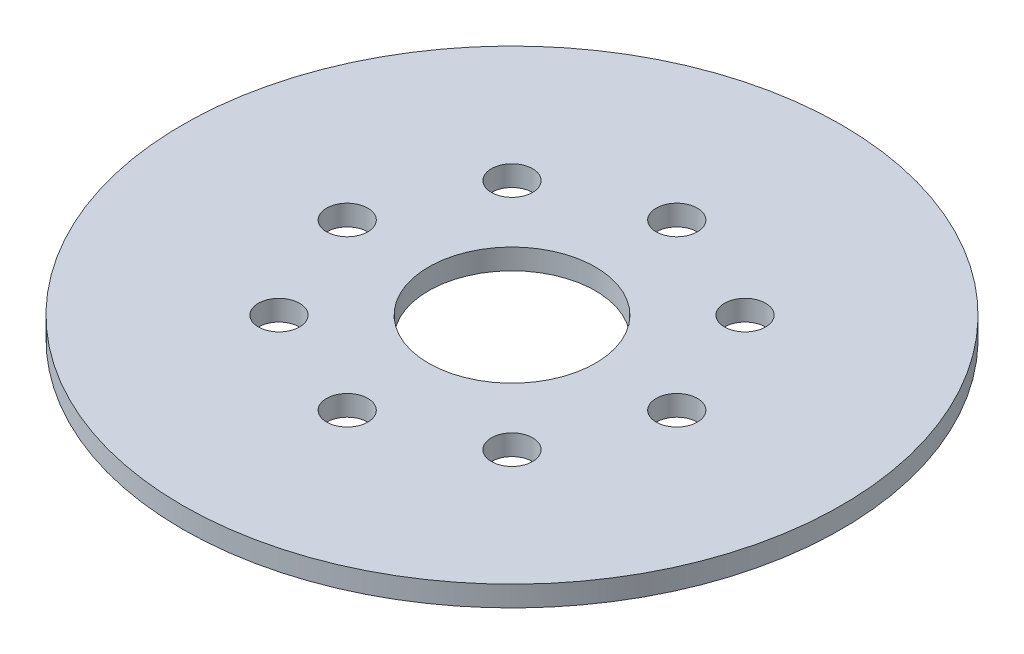
ISO-10303-21;
HEADER;
FILE_DESCRIPTION(('STEP AP214'),'2;1');
FILE_NAME('part.step','',(''),(''),'','','');
FILE_SCHEMA(('AUTOMOTIVE_DESIGN { 1 0 10303 214 1 1 1 1 }'));
ENDSEC;
DATA;
#1=APPLICATION_CONTEXT('core data for automotive mechanical design processes');
#2=APPLICATION_PROTOCOL_DEFINITION('international standard','automotive_design',2000,#1);
#3=PRODUCT_CONTEXT('',#1,'mechanical');
#4=PRODUCT('Part','Part','',(#3));
#5=PRODUCT_RELATED_PRODUCT_CATEGORY('part','',(#4));
#6=PRODUCT_DEFINITION_FORMATION('','',#4);
#7=PRODUCT_DEFINITION_CONTEXT('part definition',#1,'design');
#8=PRODUCT_DEFINITION('design','',#6,#7);
#9=PRODUCT_DEFINITION_SHAPE('','',#8);
#10=(LENGTH_UNIT() NAMED_UNIT(*) SI_UNIT(.MILLI.,.METRE.));
#11=(NAMED_UNIT(*) PLANE_ANGLE_UNIT() SI_UNIT($,.RADIAN.));
#12=(NAMED_UNIT(*) SI_UNIT($,.STERADIAN.) SOLID_ANGLE_UNIT());
#13=UNCERTAINTY_MEASURE_WITH_UNIT(LENGTH_MEASURE(1.E-05),#10,'distance_accuracy_value','');
#14=(GEOMETRIC_REPRESENTATION_CONTEXT(3) GLOBAL_UNCERTAINTY_ASSIGNED_CONTEXT((#13)) GLOBAL_UNIT_ASSIGNED_CONTEXT((#10,
#11,#12)) REPRESENTATION_CONTEXT('',''));
#15=CARTESIAN_POINT('',(0.,0.,0.));
#16=DIRECTION('',(0.,0.,1.));
#17=DIRECTION('',(1.,0.,0.));
#18=AXIS2_PLACEMENT_3D('',#15,#16,#17);
#19=CARTESIAN_POINT('',(0.,1.,0.));
#20=DIRECTION('',(0.,1.,0.));
#21=DIRECTION('',(0.,0.,1.));
#22=AXIS2_PLACEMENT_3D('',#19,#20,#21);
#23=PLANE('',#22);
#24=CARTESIAN_POINT('',(-8.,1.,0.));
#25=DIRECTION('',(0.,1.,0.));
#26=DIRECTION('',(0.,0.,1.));
#27=AXIS2_PLACEMENT_3D('',#24,#25,#26);
#28=CIRCLE('',#27,1.);
#29=CARTESIAN_POINT('',(-8.,1.,0.999999999999917));
#30=VERTEX_POINT('',#29);
#31=EDGE_CURVE('E82',#30,#30,#28,.T.);
#32=ORIENTED_EDGE('',*,*,#31,.F.);
#33=EDGE_LOOP('',(#32));
#34=FACE_BOUND('',#33,.T.);
#35=CARTESIAN_POINT('',(0.,1.,8.));
#36=DIRECTION('',(0.,1.,0.));
#37=DIRECTION('',(0.,0.,1.));
#38=AXIS2_PLACEMENT_3D('',#35,#36,#37);
#39=CIRCLE('',#38,1.);
#40=CARTESIAN_POINT('',(0.,1.,9.));
#41=VERTEX_POINT('',#40);
#42=EDGE_CURVE('E70',#41,#41,#39,.T.);
#43=ORIENTED_EDGE('',*,*,#42,.F.);
#44=EDGE_LOOP('',(#43));
#45=FACE_BOUND('',#44,.T.);
#46=CARTESIAN_POINT('',(8.,1.,0.));
#47=DIRECTION('',(0.,1.,0.));
#48=DIRECTION('',(0.,0.,1.));
#49=AXIS2_PLACEMENT_3D('',#46,#47,#48);
#50=CIRCLE('',#49,1.);
#51=CARTESIAN_POINT('',(8.,1.,1.00000000000003));
#52=VERTEX_POINT('',#51);
#53=EDGE_CURVE('E58',#52,#52,#50,.T.);
#54=ORIENTED_EDGE('',*,*,#53,.F.);
#55=EDGE_LOOP('',(#54));
#56=FACE_BOUND('',#55,.T.);
#57=CARTESIAN_POINT('',(0.,1.,-8.));
#58=DIRECTION('',(0.,1.,0.));
#59=DIRECTION('',(0.,0.,1.));
#60=AXIS2_PLACEMENT_3D('',#57,#58,#59);
#61=CIRCLE('',#60,1.);
#62=CARTESIAN_POINT('',(0.,1.,-7.));
#63=VERTEX_POINT('',#62);
#64=EDGE_CURVE('E46',#63,#63,#61,.T.);
#65=ORIENTED_EDGE('',*,*,#64,.F.);
#66=EDGE_LOOP('',(#65));
#67=FACE_BOUND('',#66,.T.);
#68=CARTESIAN_POINT('',(0.,1.,0.));
#69=DIRECTION('',(0.,1.,0.));
#70=DIRECTION('',(0.,0.,1.));
#71=AXIS2_PLACEMENT_3D('',#68,#69,#70);
#72=CIRCLE('',#71,16.);
#73=CARTESIAN_POINT('',(0.,1.,16.));
#74=VERTEX_POINT('',#73);
#75=EDGE_CURVE('E10',#74,#74,#72,.T.);
#76=ORIENTED_EDGE('',*,*,#75,.T.);
#77=EDGE_LOOP('',(#76));
#78=FACE_BOUND('',#77,.T.);
#79=CARTESIAN_POINT('',(0.,1.,0.));
#80=DIRECTION('',(0.,1.,0.));
#81=DIRECTION('',(0.,0.,1.));
#82=AXIS2_PLACEMENT_3D('',#79,#80,#81);
#83=CIRCLE('',#82,4.05);
#84=CARTESIAN_POINT('',(0.,1.,4.05));
#85=VERTEX_POINT('',#84);
#86=EDGE_CURVE('E41',#85,#85,#83,.T.);
#87=ORIENTED_EDGE('',*,*,#86,.F.);
#88=EDGE_LOOP('',(#87));
#89=FACE_BOUND('',#88,.T.);
#90=CARTESIAN_POINT('',(5.65685424949239,1.,-5.65685424949237));
#91=DIRECTION('',(0.,1.,0.));
#92=DIRECTION('',(0.,0.,1.));
#93=AXIS2_PLACEMENT_3D('',#90,#91,#92);
#94=CIRCLE('',#93,1.);
#95=CARTESIAN_POINT('',(5.65685424949239,1.,-4.65685424949237));
#96=VERTEX_POINT('',#95);
#97=EDGE_CURVE('E52',#96,#96,#94,.T.);
#98=ORIENTED_EDGE('',*,*,#97,.F.);
#99=EDGE_LOOP('',(#98));
#100=FACE_BOUND('',#99,.T.);
#101=CARTESIAN_POINT('',(5.65685424949235,1.,5.65685424949241));
#102=DIRECTION('',(0.,1.,0.));
#103=DIRECTION('',(0.,0.,1.));
#104=AXIS2_PLACEMENT_3D('',#101,#102,#103);
#105=CIRCLE('',#104,1.);
#106=CARTESIAN_POINT('',(5.65685424949235,1.,6.65685424949241));
#107=VERTEX_POINT('',#106);
#108=EDGE_CURVE('E64',#107,#107,#105,.T.);
#109=ORIENTED_EDGE('',*,*,#108,.F.);
#110=EDGE_LOOP('',(#109));
#111=FACE_BOUND('',#110,.T.);
#112=CARTESIAN_POINT('',(-5.65685424949243,1.,5.65685424949233));
#113=DIRECTION('',(0.,1.,0.));
#114=DIRECTION('',(0.,0.,1.));
#115=AXIS2_PLACEMENT_3D('',#112,#113,#114);
#116=CIRCLE('',#115,1.);
#117=CARTESIAN_POINT('',(-5.65685424949243,1.,6.65685424949233));
#118=VERTEX_POINT('',#117);
#119=EDGE_CURVE('E76',#118,#118,#116,.T.);
#120=ORIENTED_EDGE('',*,*,#119,.F.);
#121=EDGE_LOOP('',(#120));
#122=FACE_BOUND('',#121,.T.);
#123=CARTESIAN_POINT('',(-5.65685424949231,1.,-5.65685424949245));
#124=DIRECTION('',(0.,1.,0.));
#125=DIRECTION('',(0.,0.,1.));
#126=AXIS2_PLACEMENT_3D('',#123,#124,#125);
#127=CIRCLE('',#126,1.);
#128=CARTESIAN_POINT('',(-5.65685424949231,1.,-4.65685424949245));
#129=VERTEX_POINT('',#128);
#130=EDGE_CURVE('E88',#129,#129,#127,.T.);
#131=ORIENTED_EDGE('',*,*,#130,.F.);
#132=EDGE_LOOP('',(#131));
#133=FACE_BOUND('',#132,.T.);
#134=ADVANCED_FACE('F30',(#34,#45,#56,#67,#78,#89,#100,#111,#122,#133),#23,.T.);
#135=CARTESIAN_POINT('',(0.,0.,0.));
#136=DIRECTION('',(0.,1.,0.));
#137=DIRECTION('',(0.,0.,1.));
#138=AXIS2_PLACEMENT_3D('',#135,#136,#137);
#139=PLANE('',#138);
#140=CARTESIAN_POINT('',(-8.,0.,0.));
#141=DIRECTION('',(0.,1.,0.));
#142=DIRECTION('',(0.,0.,1.));
#143=AXIS2_PLACEMENT_3D('',#140,#141,#142);
#144=CIRCLE('',#143,1.);
#145=CARTESIAN_POINT('',(-8.,0.,0.999999999999917));
#146=VERTEX_POINT('',#145);
#147=EDGE_CURVE('E85',#146,#146,#144,.T.);
#148=ORIENTED_EDGE('',*,*,#147,.T.);
#149=EDGE_LOOP('',(#148));
#150=FACE_BOUND('',#149,.T.);
#151=CARTESIAN_POINT('',(0.,0.,8.));
#152=DIRECTION('',(0.,1.,0.));
#153=DIRECTION('',(0.,0.,1.));
#154=AXIS2_PLACEMENT_3D('',#151,#152,#153);
#155=CIRCLE('',#154,1.);
#156=CARTESIAN_POINT('',(0.,0.,9.));
#157=VERTEX_POINT('',#156);
#158=EDGE_CURVE('E73',#157,#157,#155,.T.);
#159=ORIENTED_EDGE('',*,*,#158,.T.);
#160=EDGE_LOOP('',(#159));
#161=FACE_BOUND('',#160,.T.);
#162=CARTESIAN_POINT('',(8.,0.,0.));
#163=DIRECTION('',(0.,1.,0.));
#164=DIRECTION('',(0.,0.,1.));
#165=AXIS2_PLACEMENT_3D('',#162,#163,#164);
#166=CIRCLE('',#165,1.);
#167=CARTESIAN_POINT('',(8.,0.,1.00000000000003));
#168=VERTEX_POINT('',#167);
#169=EDGE_CURVE('E61',#168,#168,#166,.T.);
#170=ORIENTED_EDGE('',*,*,#169,.T.);
#171=EDGE_LOOP('',(#170));
#172=FACE_BOUND('',#171,.T.);
#173=CARTESIAN_POINT('',(0.,0.,-8.));
#174=DIRECTION('',(0.,1.,0.));
#175=DIRECTION('',(0.,0.,1.));
#176=AXIS2_PLACEMENT_3D('',#173,#174,#175);
#177=CIRCLE('',#176,1.);
#178=CARTESIAN_POINT('',(0.,0.,-7.));
#179=VERTEX_POINT('',#178);
#180=EDGE_CURVE('E49',#179,#179,#177,.T.);
#181=ORIENTED_EDGE('',*,*,#180,.T.);
#182=EDGE_LOOP('',(#181));
#183=FACE_BOUND('',#182,.T.);
#184=CARTESIAN_POINT('',(0.,0.,0.));
#185=DIRECTION('',(0.,1.,0.));
#186=DIRECTION('',(0.,0.,1.));
#187=AXIS2_PLACEMENT_3D('',#184,#185,#186);
#188=CIRCLE('',#187,16.);
#189=CARTESIAN_POINT('',(0.,0.,16.));
#190=VERTEX_POINT('',#189);
#191=EDGE_CURVE('E34',#190,#190,#188,.T.);
#192=ORIENTED_EDGE('',*,*,#191,.F.);
#193=EDGE_LOOP('',(#192));
#194=FACE_BOUND('',#193,.T.);
#195=CARTESIAN_POINT('',(0.,0.,0.));
#196=DIRECTION('',(0.,1.,0.));
#197=DIRECTION('',(0.,0.,1.));
#198=AXIS2_PLACEMENT_3D('',#195,#196,#197);
#199=CIRCLE('',#198,4.05);
#200=CARTESIAN_POINT('',(0.,0.,4.05));
#201=VERTEX_POINT('',#200);
#202=EDGE_CURVE('E43',#201,#201,#199,.T.);
#203=ORIENTED_EDGE('',*,*,#202,.T.);
#204=EDGE_LOOP('',(#203));
#205=FACE_BOUND('',#204,.T.);
#206=CARTESIAN_POINT('',(5.65685424949239,0.,-5.65685424949237));
#207=DIRECTION('',(0.,1.,0.));
#208=DIRECTION('',(0.,0.,1.));
#209=AXIS2_PLACEMENT_3D('',#206,#207,#208);
#210=CIRCLE('',#209,1.);
#211=CARTESIAN_POINT('',(5.65685424949239,0.,-4.65685424949237));
#212=VERTEX_POINT('',#211);
#213=EDGE_CURVE('E55',#212,#212,#210,.T.);
#214=ORIENTED_EDGE('',*,*,#213,.T.);
#215=EDGE_LOOP('',(#214));
#216=FACE_BOUND('',#215,.T.);
#217=CARTESIAN_POINT('',(5.65685424949235,0.,5.65685424949241));
#218=DIRECTION('',(0.,1.,0.));
#219=DIRECTION('',(0.,0.,1.));
#220=AXIS2_PLACEMENT_3D('',#217,#218,#219);
#221=CIRCLE('',#220,1.);
#222=CARTESIAN_POINT('',(5.65685424949235,0.,6.65685424949241));
#223=VERTEX_POINT('',#222);
#224=EDGE_CURVE('E67',#223,#223,#221,.T.);
#225=ORIENTED_EDGE('',*,*,#224,.T.);
#226=EDGE_LOOP('',(#225));
#227=FACE_BOUND('',#226,.T.);
#228=CARTESIAN_POINT('',(-5.65685424949243,0.,5.65685424949233));
#229=DIRECTION('',(0.,1.,0.));
#230=DIRECTION('',(0.,0.,1.));
#231=AXIS2_PLACEMENT_3D('',#228,#229,#230);
#232=CIRCLE('',#231,1.);
#233=CARTESIAN_POINT('',(-5.65685424949243,0.,6.65685424949233));
#234=VERTEX_POINT('',#233);
#235=EDGE_CURVE('E79',#234,#234,#232,.T.);
#236=ORIENTED_EDGE('',*,*,#235,.T.);
#237=EDGE_LOOP('',(#236));
#238=FACE_BOUND('',#237,.T.);
#239=CARTESIAN_POINT('',(-5.65685424949231,0.,-5.65685424949245));
#240=DIRECTION('',(0.,1.,0.));
#241=DIRECTION('',(0.,0.,1.));
#242=AXIS2_PLACEMENT_3D('',#239,#240,#241);
#243=CIRCLE('',#242,1.);
#244=CARTESIAN_POINT('',(-5.65685424949231,0.,-4.65685424949245));
#245=VERTEX_POINT('',#244);
#246=EDGE_CURVE('E91',#245,#245,#243,.T.);
#247=ORIENTED_EDGE('',*,*,#246,.T.);
#248=EDGE_LOOP('',(#247));
#249=FACE_BOUND('',#248,.T.);
#250=ADVANCED_FACE('F101',(#150,#161,#172,#183,#194,#205,#216,#227,#238,#249),#139,.F.);
#251=CARTESIAN_POINT('',(0.,1.,0.));
#252=DIRECTION('',(0.,-1.,0.));
#253=DIRECTION('',(0.,0.,-1.));
#254=AXIS2_PLACEMENT_3D('',#251,#252,#253);
#255=CYLINDRICAL_SURFACE('',#254,16.);
#256=ORIENTED_EDGE('',*,*,#75,.F.);
#257=EDGE_LOOP('',(#256));
#258=FACE_BOUND('',#257,.T.);
#259=ORIENTED_EDGE('',*,*,#191,.T.);
#260=EDGE_LOOP('',(#259));
#261=FACE_BOUND('',#260,.T.);
#262=ADVANCED_FACE('F32',(#258,#261),#255,.T.);
#263=CARTESIAN_POINT('',(0.,1.,0.));
#264=DIRECTION('',(0.,-1.,0.));
#265=DIRECTION('',(0.,0.,-1.));
#266=AXIS2_PLACEMENT_3D('',#263,#264,#265);
#267=CYLINDRICAL_SURFACE('',#266,4.05);
#268=ORIENTED_EDGE('',*,*,#86,.T.);
#269=EDGE_LOOP('',(#268));
#270=FACE_BOUND('',#269,.T.);
#271=ORIENTED_EDGE('',*,*,#202,.F.);
#272=EDGE_LOOP('',(#271));
#273=FACE_BOUND('',#272,.T.);
#274=ADVANCED_FACE('F111',(#270,#273),#267,.F.);
#275=CARTESIAN_POINT('',(0.,1.,-8.));
#276=DIRECTION('',(0.,-1.,0.));
#277=DIRECTION('',(0.,0.,-1.));
#278=AXIS2_PLACEMENT_3D('',#275,#276,#277);
#279=CYLINDRICAL_SURFACE('',#278,1.);
#280=ORIENTED_EDGE('',*,*,#64,.T.);
#281=EDGE_LOOP('',(#280));
#282=FACE_BOUND('',#281,.T.);
#283=ORIENTED_EDGE('',*,*,#180,.F.);
#284=EDGE_LOOP('',(#283));
#285=FACE_BOUND('',#284,.T.);
#286=ADVANCED_FACE('F114',(#282,#285),#279,.F.);
#287=CARTESIAN_POINT('',(5.65685424949239,1.,-5.65685424949237));
#288=DIRECTION('',(0.,-1.,0.));
#289=DIRECTION('',(0.,0.,-1.));
#290=AXIS2_PLACEMENT_3D('',#287,#288,#289);
#291=CYLINDRICAL_SURFACE('',#290,1.);
#292=ORIENTED_EDGE('',*,*,#97,.T.);
#293=EDGE_LOOP('',(#292));
#294=FACE_BOUND('',#293,.T.);
#295=ORIENTED_EDGE('',*,*,#213,.F.);
#296=EDGE_LOOP('',(#295));
#297=FACE_BOUND('',#296,.T.);
#298=ADVANCED_FACE('F118',(#294,#297),#291,.F.);
#299=CARTESIAN_POINT('',(8.,1.,0.));
#300=DIRECTION('',(0.,-1.,0.));
#301=DIRECTION('',(0.,0.,-1.));
#302=AXIS2_PLACEMENT_3D('',#299,#300,#301);
#303=CYLINDRICAL_SURFACE('',#302,1.);
#304=ORIENTED_EDGE('',*,*,#53,.T.);
#305=EDGE_LOOP('',(#304));
#306=FACE_BOUND('',#305,.T.);
#307=ORIENTED_EDGE('',*,*,#169,.F.);
#308=EDGE_LOOP('',(#307));
#309=FACE_BOUND('',#308,.T.);
#310=ADVANCED_FACE('F122',(#306,#309),#303,.F.);
#311=CARTESIAN_POINT('',(5.65685424949235,1.,5.65685424949241));
#312=DIRECTION('',(0.,-1.,0.));
#313=DIRECTION('',(0.,0.,-1.));
#314=AXIS2_PLACEMENT_3D('',#311,#312,#313);
#315=CYLINDRICAL_SURFACE('',#314,1.);
#316=ORIENTED_EDGE('',*,*,#108,.T.);
#317=EDGE_LOOP('',(#316));
#318=FACE_BOUND('',#317,.T.);
#319=ORIENTED_EDGE('',*,*,#224,.F.);
#320=EDGE_LOOP('',(#319));
#321=FACE_BOUND('',#320,.T.);
#322=ADVANCED_FACE('F126',(#318,#321),#315,.F.);
#323=CARTESIAN_POINT('',(0.,1.,8.));
#324=DIRECTION('',(0.,-1.,0.));
#325=DIRECTION('',(0.,0.,-1.));
#326=AXIS2_PLACEMENT_3D('',#323,#324,#325);
#327=CYLINDRICAL_SURFACE('',#326,1.);
#328=ORIENTED_EDGE('',*,*,#42,.T.);
#329=EDGE_LOOP('',(#328));
#330=FACE_BOUND('',#329,.T.);
#331=ORIENTED_EDGE('',*,*,#158,.F.);
#332=EDGE_LOOP('',(#331));
#333=FACE_BOUND('',#332,.T.);
#334=ADVANCED_FACE('F130',(#330,#333),#327,.F.);
#335=CARTESIAN_POINT('',(-5.65685424949243,1.,5.65685424949233));
#336=DIRECTION('',(0.,-1.,0.));
#337=DIRECTION('',(0.,0.,-1.));
#338=AXIS2_PLACEMENT_3D('',#335,#336,#337);
#339=CYLINDRICAL_SURFACE('',#338,1.);
#340=ORIENTED_EDGE('',*,*,#119,.T.);
#341=EDGE_LOOP('',(#340));
#342=FACE_BOUND('',#341,.T.);
#343=ORIENTED_EDGE('',*,*,#235,.F.);
#344=EDGE_LOOP('',(#343));
#345=FACE_BOUND('',#344,.T.);
#346=ADVANCED_FACE('F134',(#342,#345),#339,.F.);
#347=CARTESIAN_POINT('',(-8.,1.,0.));
#348=DIRECTION('',(0.,-1.,0.));
#349=DIRECTION('',(0.,0.,-1.));
#350=AXIS2_PLACEMENT_3D('',#347,#348,#349);
#351=CYLINDRICAL_SURFACE('',#350,1.);
#352=ORIENTED_EDGE('',*,*,#31,.T.);
#353=EDGE_LOOP('',(#352));
#354=FACE_BOUND('',#353,.T.);
#355=ORIENTED_EDGE('',*,*,#147,.F.);
#356=EDGE_LOOP('',(#355));
#357=FACE_BOUND('',#356,.T.);
#358=ADVANCED_FACE('F138',(#354,#357),#351,.F.);
#359=CARTESIAN_POINT('',(-5.65685424949231,1.,-5.65685424949245));
#360=DIRECTION('',(0.,-1.,0.));
#361=DIRECTION('',(0.,0.,-1.));
#362=AXIS2_PLACEMENT_3D('',#359,#360,#361);
#363=CYLINDRICAL_SURFACE('',#362,1.);
#364=ORIENTED_EDGE('',*,*,#130,.T.);
#365=EDGE_LOOP('',(#364));
#366=FACE_BOUND('',#365,.T.);
#367=ORIENTED_EDGE('',*,*,#246,.F.);
#368=EDGE_LOOP('',(#367));
#369=FACE_BOUND('',#368,.T.);
#370=ADVANCED_FACE('F97',(#366,#369),#363,.F.);
#371=CLOSED_SHELL('',(#134,#250,#262,#274,#286,#298,#310,#322,#334,#346,#358,#370));
#372=MANIFOLD_SOLID_BREP('B2',#371);
#373=ADVANCED_BREP_SHAPE_REPRESENTATION('',(#18,#372),#14);
#374=SHAPE_DEFINITION_REPRESENTATION(#9,#373);
ENDSEC;
END-ISO-10303-21;
